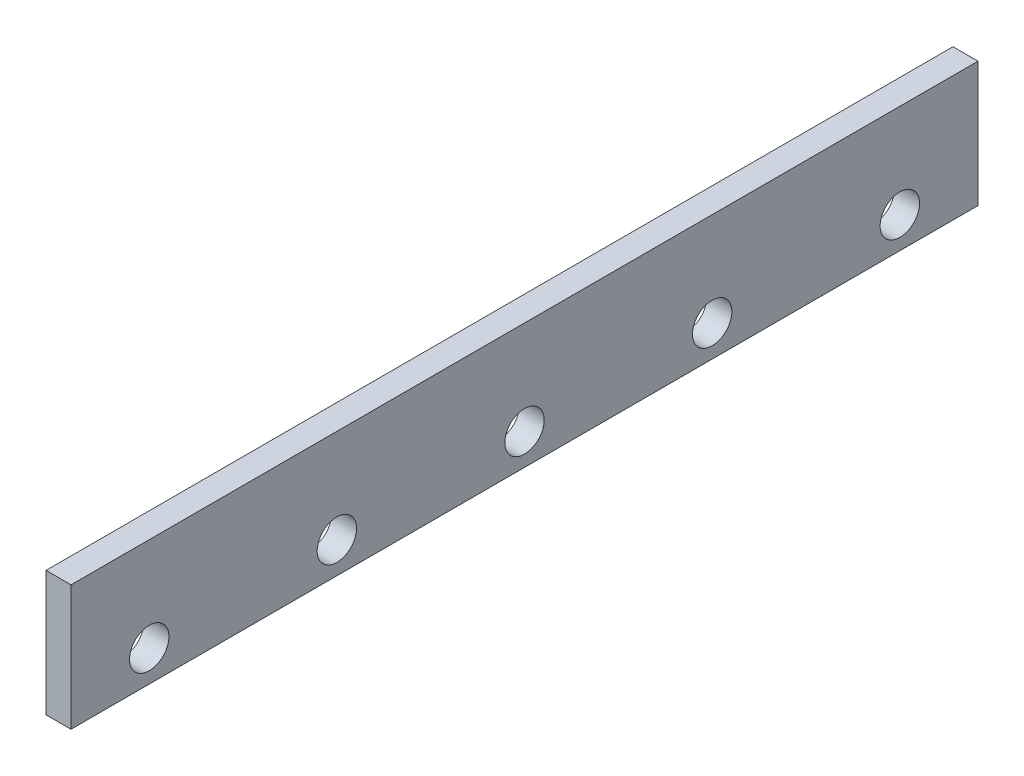
ISO-10303-21;
HEADER;
FILE_DESCRIPTION(('STEP AP214'),'2;1');
FILE_NAME('part.step','',(''),(''),'','','');
FILE_SCHEMA(('AUTOMOTIVE_DESIGN { 1 0 10303 214 1 1 1 1 }'));
ENDSEC;
DATA;
#1=APPLICATION_CONTEXT('core data for automotive mechanical design processes');
#2=APPLICATION_PROTOCOL_DEFINITION('international standard','automotive_design',2000,#1);
#3=PRODUCT_CONTEXT('',#1,'mechanical');
#4=PRODUCT('Part','Part','',(#3));
#5=PRODUCT_RELATED_PRODUCT_CATEGORY('part','',(#4));
#6=PRODUCT_DEFINITION_FORMATION('','',#4);
#7=PRODUCT_DEFINITION_CONTEXT('part definition',#1,'design');
#8=PRODUCT_DEFINITION('design','',#6,#7);
#9=PRODUCT_DEFINITION_SHAPE('','',#8);
#10=(LENGTH_UNIT() NAMED_UNIT(*) SI_UNIT(.MILLI.,.METRE.));
#11=(NAMED_UNIT(*) PLANE_ANGLE_UNIT() SI_UNIT($,.RADIAN.));
#12=(NAMED_UNIT(*) SI_UNIT($,.STERADIAN.) SOLID_ANGLE_UNIT());
#13=UNCERTAINTY_MEASURE_WITH_UNIT(LENGTH_MEASURE(1.E-05),#10,'distance_accuracy_value','');
#14=(GEOMETRIC_REPRESENTATION_CONTEXT(3) GLOBAL_UNCERTAINTY_ASSIGNED_CONTEXT((#13)) GLOBAL_UNIT_ASSIGNED_CONTEXT((#10,
#11,#12)) REPRESENTATION_CONTEXT('',''));
#15=CARTESIAN_POINT('',(0.,0.,0.));
#16=DIRECTION('',(0.,0.,1.));
#17=DIRECTION('',(1.,0.,0.));
#18=AXIS2_PLACEMENT_3D('',#15,#16,#17);
#19=CARTESIAN_POINT('',(8.,0.,0.));
#20=DIRECTION('',(-1.,0.,0.));
#21=DIRECTION('',(0.,0.,1.));
#22=AXIS2_PLACEMENT_3D('',#19,#20,#21);
#23=PLANE('',#22);
#24=DIRECTION('',(0.,1.,0.));
#25=VECTOR('',#24,1.);
#26=CARTESIAN_POINT('',(8.,-40.,-290.));
#27=LINE('',#26,#25);
#28=CARTESIAN_POINT('',(8.,-40.,-290.));
#29=VERTEX_POINT('',#28);
#30=CARTESIAN_POINT('',(8.,40.,-290.));
#31=VERTEX_POINT('',#30);
#32=EDGE_CURVE('E92',#29,#31,#27,.T.);
#33=ORIENTED_EDGE('',*,*,#32,.T.);
#34=DIRECTION('',(0.,0.,1.));
#35=VECTOR('',#34,1.);
#36=CARTESIAN_POINT('',(8.,40.,290.));
#37=LINE('',#36,#35);
#38=CARTESIAN_POINT('',(8.,40.,290.));
#39=VERTEX_POINT('',#38);
#40=EDGE_CURVE('E87',#31,#39,#37,.T.);
#41=ORIENTED_EDGE('',*,*,#40,.T.);
#42=DIRECTION('',(0.,-1.,0.));
#43=VECTOR('',#42,1.);
#44=CARTESIAN_POINT('',(8.,-40.,290.));
#45=LINE('',#44,#43);
#46=CARTESIAN_POINT('',(8.,-40.,290.));
#47=VERTEX_POINT('',#46);
#48=EDGE_CURVE('E90',#39,#47,#45,.T.);
#49=ORIENTED_EDGE('',*,*,#48,.T.);
#50=DIRECTION('',(0.,0.,-1.));
#51=VECTOR('',#50,1.);
#52=CARTESIAN_POINT('',(8.,-40.,290.));
#53=LINE('',#52,#51);
#54=EDGE_CURVE('E57',#47,#29,#53,.T.);
#55=ORIENTED_EDGE('',*,*,#54,.T.);
#56=EDGE_LOOP('',(#33,#41,#49,#55));
#57=FACE_BOUND('',#56,.T.);
#58=CARTESIAN_POINT('',(8.,-20.,240.));
#59=DIRECTION('',(1.,0.,0.));
#60=DIRECTION('',(0.,0.,-1.));
#61=AXIS2_PLACEMENT_3D('',#58,#59,#60);
#62=CIRCLE('',#61,12.6);
#63=CARTESIAN_POINT('',(8.,-20.,227.4));
#64=VERTEX_POINT('',#63);
#65=EDGE_CURVE('E112',#64,#64,#62,.T.);
#66=ORIENTED_EDGE('',*,*,#65,.F.);
#67=EDGE_LOOP('',(#66));
#68=FACE_BOUND('',#67,.T.);
#69=CARTESIAN_POINT('',(8.,-20.,-240.));
#70=DIRECTION('',(1.,0.,0.));
#71=DIRECTION('',(0.,0.,-1.));
#72=AXIS2_PLACEMENT_3D('',#69,#70,#71);
#73=CIRCLE('',#72,12.6);
#74=CARTESIAN_POINT('',(8.,-20.,-252.6));
#75=VERTEX_POINT('',#74);
#76=EDGE_CURVE('E134',#75,#75,#73,.T.);
#77=ORIENTED_EDGE('',*,*,#76,.F.);
#78=EDGE_LOOP('',(#77));
#79=FACE_BOUND('',#78,.T.);
#80=CARTESIAN_POINT('',(8.,-20.,120.));
#81=DIRECTION('',(1.,0.,0.));
#82=DIRECTION('',(0.,0.,-1.));
#83=AXIS2_PLACEMENT_3D('',#80,#81,#82);
#84=CIRCLE('',#83,12.6);
#85=CARTESIAN_POINT('',(8.,-20.,107.4));
#86=VERTEX_POINT('',#85);
#87=EDGE_CURVE('E142',#86,#86,#84,.T.);
#88=ORIENTED_EDGE('',*,*,#87,.F.);
#89=EDGE_LOOP('',(#88));
#90=FACE_BOUND('',#89,.T.);
#91=CARTESIAN_POINT('',(8.,-20.,0.));
#92=DIRECTION('',(1.,0.,0.));
#93=DIRECTION('',(0.,0.,-1.));
#94=AXIS2_PLACEMENT_3D('',#91,#92,#93);
#95=CIRCLE('',#94,12.6);
#96=CARTESIAN_POINT('',(8.,-20.,-12.6));
#97=VERTEX_POINT('',#96);
#98=EDGE_CURVE('E150',#97,#97,#95,.T.);
#99=ORIENTED_EDGE('',*,*,#98,.F.);
#100=EDGE_LOOP('',(#99));
#101=FACE_BOUND('',#100,.T.);
#102=CARTESIAN_POINT('',(8.,-20.,-120.));
#103=DIRECTION('',(1.,0.,0.));
#104=DIRECTION('',(0.,0.,-1.));
#105=AXIS2_PLACEMENT_3D('',#102,#103,#104);
#106=CIRCLE('',#105,12.6);
#107=CARTESIAN_POINT('',(8.,-20.,-132.6));
#108=VERTEX_POINT('',#107);
#109=EDGE_CURVE('E158',#108,#108,#106,.T.);
#110=ORIENTED_EDGE('',*,*,#109,.F.);
#111=EDGE_LOOP('',(#110));
#112=FACE_BOUND('',#111,.T.);
#113=ADVANCED_FACE('F39',(#57,#68,#79,#90,#101,#112),#23,.F.);
#114=CARTESIAN_POINT('',(-8.,0.,0.));
#115=DIRECTION('',(-1.,0.,0.));
#116=DIRECTION('',(0.,0.,1.));
#117=AXIS2_PLACEMENT_3D('',#114,#115,#116);
#118=PLANE('',#117);
#119=CARTESIAN_POINT('',(-8.,-20.,0.));
#120=DIRECTION('',(1.,0.,0.));
#121=DIRECTION('',(0.,0.,-1.));
#122=AXIS2_PLACEMENT_3D('',#119,#120,#121);
#123=CIRCLE('',#122,12.6);
#124=CARTESIAN_POINT('',(-8.,-20.,-12.6));
#125=VERTEX_POINT('',#124);
#126=EDGE_CURVE('E154',#125,#125,#123,.T.);
#127=ORIENTED_EDGE('',*,*,#126,.T.);
#128=EDGE_LOOP('',(#127));
#129=FACE_BOUND('',#128,.T.);
#130=CARTESIAN_POINT('',(-8.,-20.,-240.));
#131=DIRECTION('',(1.,0.,0.));
#132=DIRECTION('',(0.,0.,-1.));
#133=AXIS2_PLACEMENT_3D('',#130,#131,#132);
#134=CIRCLE('',#133,12.6);
#135=CARTESIAN_POINT('',(-8.,-20.,-252.6));
#136=VERTEX_POINT('',#135);
#137=EDGE_CURVE('E138',#136,#136,#134,.T.);
#138=ORIENTED_EDGE('',*,*,#137,.T.);
#139=EDGE_LOOP('',(#138));
#140=FACE_BOUND('',#139,.T.);
#141=DIRECTION('',(0.,1.,0.));
#142=VECTOR('',#141,1.);
#143=CARTESIAN_POINT('',(-8.,-40.,-290.));
#144=LINE('',#143,#142);
#145=CARTESIAN_POINT('',(-8.,-40.,-290.));
#146=VERTEX_POINT('',#145);
#147=CARTESIAN_POINT('',(-8.,40.,-290.));
#148=VERTEX_POINT('',#147);
#149=EDGE_CURVE('E108',#146,#148,#144,.T.);
#150=ORIENTED_EDGE('',*,*,#149,.F.);
#151=DIRECTION('',(0.,0.,-1.));
#152=VECTOR('',#151,1.);
#153=CARTESIAN_POINT('',(-8.,-40.,290.));
#154=LINE('',#153,#152);
#155=CARTESIAN_POINT('',(-8.,-40.,290.));
#156=VERTEX_POINT('',#155);
#157=EDGE_CURVE('E80',#156,#146,#154,.T.);
#158=ORIENTED_EDGE('',*,*,#157,.F.);
#159=DIRECTION('',(0.,-1.,0.));
#160=VECTOR('',#159,1.);
#161=CARTESIAN_POINT('',(-8.,-40.,290.));
#162=LINE('',#161,#160);
#163=CARTESIAN_POINT('',(-8.,40.,290.));
#164=VERTEX_POINT('',#163);
#165=EDGE_CURVE('E74',#164,#156,#162,.T.);
#166=ORIENTED_EDGE('',*,*,#165,.F.);
#167=DIRECTION('',(0.,0.,1.));
#168=VECTOR('',#167,1.);
#169=CARTESIAN_POINT('',(-8.,40.,290.));
#170=LINE('',#169,#168);
#171=EDGE_CURVE('E97',#148,#164,#170,.T.);
#172=ORIENTED_EDGE('',*,*,#171,.F.);
#173=EDGE_LOOP('',(#150,#158,#166,#172));
#174=FACE_BOUND('',#173,.T.);
#175=CARTESIAN_POINT('',(-8.,-20.,240.));
#176=DIRECTION('',(1.,0.,0.));
#177=DIRECTION('',(0.,0.,-1.));
#178=AXIS2_PLACEMENT_3D('',#175,#176,#177);
#179=CIRCLE('',#178,12.6);
#180=CARTESIAN_POINT('',(-8.,-20.,227.4));
#181=VERTEX_POINT('',#180);
#182=EDGE_CURVE('E130',#181,#181,#179,.T.);
#183=ORIENTED_EDGE('',*,*,#182,.T.);
#184=EDGE_LOOP('',(#183));
#185=FACE_BOUND('',#184,.T.);
#186=CARTESIAN_POINT('',(-8.,-20.,120.));
#187=DIRECTION('',(1.,0.,0.));
#188=DIRECTION('',(0.,0.,-1.));
#189=AXIS2_PLACEMENT_3D('',#186,#187,#188);
#190=CIRCLE('',#189,12.6);
#191=CARTESIAN_POINT('',(-8.,-20.,107.4));
#192=VERTEX_POINT('',#191);
#193=EDGE_CURVE('E146',#192,#192,#190,.T.);
#194=ORIENTED_EDGE('',*,*,#193,.T.);
#195=EDGE_LOOP('',(#194));
#196=FACE_BOUND('',#195,.T.);
#197=CARTESIAN_POINT('',(-8.,-20.,-120.));
#198=DIRECTION('',(1.,0.,0.));
#199=DIRECTION('',(0.,0.,-1.));
#200=AXIS2_PLACEMENT_3D('',#197,#198,#199);
#201=CIRCLE('',#200,12.6);
#202=CARTESIAN_POINT('',(-8.,-20.,-132.6));
#203=VERTEX_POINT('',#202);
#204=EDGE_CURVE('E162',#203,#203,#201,.T.);
#205=ORIENTED_EDGE('',*,*,#204,.T.);
#206=EDGE_LOOP('',(#205));
#207=FACE_BOUND('',#206,.T.);
#208=ADVANCED_FACE('F125',(#129,#140,#174,#185,#196,#207),#118,.T.);
#209=CARTESIAN_POINT('',(8.,-40.,-290.));
#210=DIRECTION('',(0.,0.,1.));
#211=DIRECTION('',(1.,0.,0.));
#212=AXIS2_PLACEMENT_3D('',#209,#210,#211);
#213=PLANE('',#212);
#214=ORIENTED_EDGE('',*,*,#149,.T.);
#215=DIRECTION('',(-1.,0.,0.));
#216=VECTOR('',#215,1.);
#217=CARTESIAN_POINT('',(8.,40.,-290.));
#218=LINE('',#217,#216);
#219=EDGE_CURVE('E11',#31,#148,#218,.T.);
#220=ORIENTED_EDGE('',*,*,#219,.F.);
#221=ORIENTED_EDGE('',*,*,#32,.F.);
#222=DIRECTION('',(-1.,0.,0.));
#223=VECTOR('',#222,1.);
#224=CARTESIAN_POINT('',(8.,-40.,-290.));
#225=LINE('',#224,#223);
#226=EDGE_CURVE('E104',#29,#146,#225,.T.);
#227=ORIENTED_EDGE('',*,*,#226,.T.);
#228=EDGE_LOOP('',(#214,#220,#221,#227));
#229=FACE_BOUND('',#228,.T.);
#230=ADVANCED_FACE('F41',(#229),#213,.F.);
#231=CARTESIAN_POINT('',(8.,40.,290.));
#232=DIRECTION('',(0.,-1.,0.));
#233=DIRECTION('',(0.,0.,-1.));
#234=AXIS2_PLACEMENT_3D('',#231,#232,#233);
#235=PLANE('',#234);
#236=ORIENTED_EDGE('',*,*,#171,.T.);
#237=DIRECTION('',(-1.,0.,0.));
#238=VECTOR('',#237,1.);
#239=CARTESIAN_POINT('',(8.,40.,290.));
#240=LINE('',#239,#238);
#241=EDGE_CURVE('E49',#39,#164,#240,.T.);
#242=ORIENTED_EDGE('',*,*,#241,.F.);
#243=ORIENTED_EDGE('',*,*,#40,.F.);
#244=ORIENTED_EDGE('',*,*,#219,.T.);
#245=EDGE_LOOP('',(#236,#242,#243,#244));
#246=FACE_BOUND('',#245,.T.);
#247=ADVANCED_FACE('F96',(#246),#235,.F.);
#248=CARTESIAN_POINT('',(8.,-40.,290.));
#249=DIRECTION('',(0.,0.,-1.));
#250=DIRECTION('',(-1.,0.,0.));
#251=AXIS2_PLACEMENT_3D('',#248,#249,#250);
#252=PLANE('',#251);
#253=ORIENTED_EDGE('',*,*,#165,.T.);
#254=DIRECTION('',(-1.,0.,0.));
#255=VECTOR('',#254,1.);
#256=CARTESIAN_POINT('',(8.,-40.,290.));
#257=LINE('',#256,#255);
#258=EDGE_CURVE('E99',#47,#156,#257,.T.);
#259=ORIENTED_EDGE('',*,*,#258,.F.);
#260=ORIENTED_EDGE('',*,*,#48,.F.);
#261=ORIENTED_EDGE('',*,*,#241,.T.);
#262=EDGE_LOOP('',(#253,#259,#260,#261));
#263=FACE_BOUND('',#262,.T.);
#264=ADVANCED_FACE('F100',(#263),#252,.F.);
#265=CARTESIAN_POINT('',(8.,-40.,290.));
#266=DIRECTION('',(0.,1.,0.));
#267=DIRECTION('',(0.,0.,1.));
#268=AXIS2_PLACEMENT_3D('',#265,#266,#267);
#269=PLANE('',#268);
#270=ORIENTED_EDGE('',*,*,#157,.T.);
#271=ORIENTED_EDGE('',*,*,#226,.F.);
#272=ORIENTED_EDGE('',*,*,#54,.F.);
#273=ORIENTED_EDGE('',*,*,#258,.T.);
#274=EDGE_LOOP('',(#270,#271,#272,#273));
#275=FACE_BOUND('',#274,.T.);
#276=ADVANCED_FACE('F122',(#275),#269,.F.);
#277=CARTESIAN_POINT('',(8.,-20.,240.));
#278=DIRECTION('',(-1.,0.,0.));
#279=DIRECTION('',(0.,0.,1.));
#280=AXIS2_PLACEMENT_3D('',#277,#278,#279);
#281=CYLINDRICAL_SURFACE('',#280,12.6);
#282=ORIENTED_EDGE('',*,*,#65,.T.);
#283=EDGE_LOOP('',(#282));
#284=FACE_BOUND('',#283,.T.);
#285=ORIENTED_EDGE('',*,*,#182,.F.);
#286=EDGE_LOOP('',(#285));
#287=FACE_BOUND('',#286,.T.);
#288=ADVANCED_FACE('F181',(#284,#287),#281,.F.);
#289=CARTESIAN_POINT('',(8.,-20.,-240.));
#290=DIRECTION('',(-1.,0.,0.));
#291=DIRECTION('',(0.,0.,1.));
#292=AXIS2_PLACEMENT_3D('',#289,#290,#291);
#293=CYLINDRICAL_SURFACE('',#292,12.6);
#294=ORIENTED_EDGE('',*,*,#76,.T.);
#295=EDGE_LOOP('',(#294));
#296=FACE_BOUND('',#295,.T.);
#297=ORIENTED_EDGE('',*,*,#137,.F.);
#298=EDGE_LOOP('',(#297));
#299=FACE_BOUND('',#298,.T.);
#300=ADVANCED_FACE('F227',(#296,#299),#293,.F.);
#301=CARTESIAN_POINT('',(8.,-20.,120.));
#302=DIRECTION('',(-1.,0.,0.));
#303=DIRECTION('',(0.,0.,1.));
#304=AXIS2_PLACEMENT_3D('',#301,#302,#303);
#305=CYLINDRICAL_SURFACE('',#304,12.6);
#306=ORIENTED_EDGE('',*,*,#87,.T.);
#307=EDGE_LOOP('',(#306));
#308=FACE_BOUND('',#307,.T.);
#309=ORIENTED_EDGE('',*,*,#193,.F.);
#310=EDGE_LOOP('',(#309));
#311=FACE_BOUND('',#310,.T.);
#312=ADVANCED_FACE('F235',(#308,#311),#305,.F.);
#313=CARTESIAN_POINT('',(8.,-20.,0.));
#314=DIRECTION('',(-1.,0.,0.));
#315=DIRECTION('',(0.,0.,1.));
#316=AXIS2_PLACEMENT_3D('',#313,#314,#315);
#317=CYLINDRICAL_SURFACE('',#316,12.6);
#318=ORIENTED_EDGE('',*,*,#98,.T.);
#319=EDGE_LOOP('',(#318));
#320=FACE_BOUND('',#319,.T.);
#321=ORIENTED_EDGE('',*,*,#126,.F.);
#322=EDGE_LOOP('',(#321));
#323=FACE_BOUND('',#322,.T.);
#324=ADVANCED_FACE('F243',(#320,#323),#317,.F.);
#325=CARTESIAN_POINT('',(8.,-20.,-120.));
#326=DIRECTION('',(-1.,0.,0.));
#327=DIRECTION('',(0.,0.,1.));
#328=AXIS2_PLACEMENT_3D('',#325,#326,#327);
#329=CYLINDRICAL_SURFACE('',#328,12.6);
#330=ORIENTED_EDGE('',*,*,#109,.T.);
#331=EDGE_LOOP('',(#330));
#332=FACE_BOUND('',#331,.T.);
#333=ORIENTED_EDGE('',*,*,#204,.F.);
#334=EDGE_LOOP('',(#333));
#335=FACE_BOUND('',#334,.T.);
#336=ADVANCED_FACE('F170',(#332,#335),#329,.F.);
#337=CLOSED_SHELL('',(#113,#208,#230,#247,#264,#276,#288,#300,#312,#324,#336));
#338=MANIFOLD_SOLID_BREP('B2',#337);
#339=ADVANCED_BREP_SHAPE_REPRESENTATION('',(#18,#338),#14);
#340=SHAPE_DEFINITION_REPRESENTATION(#9,#339);
ENDSEC;
END-ISO-10303-21;
